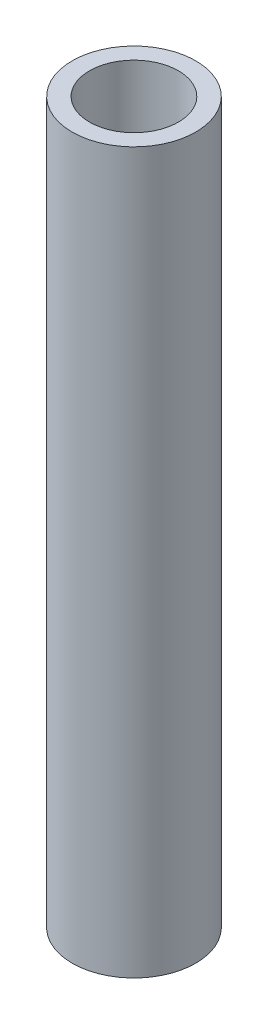
ISO-10303-21;
HEADER;
FILE_DESCRIPTION(('STEP AP214'),'2;1');
FILE_NAME('part.step','',(''),(''),'','','');
FILE_SCHEMA(('AUTOMOTIVE_DESIGN { 1 0 10303 214 1 1 1 1 }'));
ENDSEC;
DATA;
#1=APPLICATION_CONTEXT('core data for automotive mechanical design processes');
#2=APPLICATION_PROTOCOL_DEFINITION('international standard','automotive_design',2000,#1);
#3=PRODUCT_CONTEXT('',#1,'mechanical');
#4=PRODUCT('Part','Part','',(#3));
#5=PRODUCT_RELATED_PRODUCT_CATEGORY('part','',(#4));
#6=PRODUCT_DEFINITION_FORMATION('','',#4);
#7=PRODUCT_DEFINITION_CONTEXT('part definition',#1,'design');
#8=PRODUCT_DEFINITION('design','',#6,#7);
#9=PRODUCT_DEFINITION_SHAPE('','',#8);
#10=(LENGTH_UNIT() NAMED_UNIT(*) SI_UNIT(.MILLI.,.METRE.));
#11=(NAMED_UNIT(*) PLANE_ANGLE_UNIT() SI_UNIT($,.RADIAN.));
#12=(NAMED_UNIT(*) SI_UNIT($,.STERADIAN.) SOLID_ANGLE_UNIT());
#13=UNCERTAINTY_MEASURE_WITH_UNIT(LENGTH_MEASURE(1.E-05),#10,'distance_accuracy_value','');
#14=(GEOMETRIC_REPRESENTATION_CONTEXT(3) GLOBAL_UNCERTAINTY_ASSIGNED_CONTEXT((#13)) GLOBAL_UNIT_ASSIGNED_CONTEXT((#10,
#11,#12)) REPRESENTATION_CONTEXT('',''));
#15=CARTESIAN_POINT('',(0.,0.,0.));
#16=DIRECTION('',(0.,0.,1.));
#17=DIRECTION('',(1.,0.,0.));
#18=AXIS2_PLACEMENT_3D('',#15,#16,#17);
#19=CARTESIAN_POINT('',(0.,37.,0.));
#20=DIRECTION('',(0.,1.,0.));
#21=DIRECTION('',(0.,0.,1.));
#22=AXIS2_PLACEMENT_3D('',#19,#20,#21);
#23=PLANE('',#22);
#24=CARTESIAN_POINT('',(0.,37.,0.));
#25=DIRECTION('',(0.,1.,0.));
#26=DIRECTION('',(0.,0.,1.));
#27=AXIS2_PLACEMENT_3D('',#24,#25,#26);
#28=CIRCLE('',#27,3.175);
#29=CARTESIAN_POINT('',(0.,37.,3.175));
#30=VERTEX_POINT('',#29);
#31=EDGE_CURVE('E10',#30,#30,#28,.T.);
#32=ORIENTED_EDGE('',*,*,#31,.T.);
#33=EDGE_LOOP('',(#32));
#34=FACE_BOUND('',#33,.T.);
#35=CARTESIAN_POINT('',(0.,37.,0.));
#36=DIRECTION('',(0.,1.,0.));
#37=DIRECTION('',(0.,0.,1.));
#38=AXIS2_PLACEMENT_3D('',#35,#36,#37);
#39=CIRCLE('',#38,2.286);
#40=CARTESIAN_POINT('',(0.,37.,2.286));
#41=VERTEX_POINT('',#40);
#42=EDGE_CURVE('E56',#41,#41,#39,.T.);
#43=ORIENTED_EDGE('',*,*,#42,.F.);
#44=EDGE_LOOP('',(#43));
#45=FACE_BOUND('',#44,.T.);
#46=ADVANCED_FACE('F43',(#34,#45),#23,.T.);
#47=CARTESIAN_POINT('',(0.,0.,0.));
#48=DIRECTION('',(0.,1.,0.));
#49=DIRECTION('',(0.,0.,1.));
#50=AXIS2_PLACEMENT_3D('',#47,#48,#49);
#51=PLANE('',#50);
#52=CARTESIAN_POINT('',(0.,0.,0.));
#53=DIRECTION('',(0.,1.,0.));
#54=DIRECTION('',(0.,0.,1.));
#55=AXIS2_PLACEMENT_3D('',#52,#53,#54);
#56=CIRCLE('',#55,3.175);
#57=CARTESIAN_POINT('',(0.,0.,3.175));
#58=VERTEX_POINT('',#57);
#59=EDGE_CURVE('E47',#58,#58,#56,.T.);
#60=ORIENTED_EDGE('',*,*,#59,.F.);
#61=EDGE_LOOP('',(#60));
#62=FACE_BOUND('',#61,.T.);
#63=CARTESIAN_POINT('',(0.,0.,0.));
#64=DIRECTION('',(0.,1.,0.));
#65=DIRECTION('',(0.,0.,1.));
#66=AXIS2_PLACEMENT_3D('',#63,#64,#65);
#67=CIRCLE('',#66,2.286);
#68=CARTESIAN_POINT('',(0.,0.,2.286));
#69=VERTEX_POINT('',#68);
#70=EDGE_CURVE('E58',#69,#69,#67,.T.);
#71=ORIENTED_EDGE('',*,*,#70,.T.);
#72=EDGE_LOOP('',(#71));
#73=FACE_BOUND('',#72,.T.);
#74=ADVANCED_FACE('F70',(#62,#73),#51,.F.);
#75=CARTESIAN_POINT('',(0.,37.,0.));
#76=DIRECTION('',(0.,-1.,0.));
#77=DIRECTION('',(0.,0.,-1.));
#78=AXIS2_PLACEMENT_3D('',#75,#76,#77);
#79=CYLINDRICAL_SURFACE('',#78,3.175);
#80=ORIENTED_EDGE('',*,*,#31,.F.);
#81=EDGE_LOOP('',(#80));
#82=FACE_BOUND('',#81,.T.);
#83=ORIENTED_EDGE('',*,*,#59,.T.);
#84=EDGE_LOOP('',(#83));
#85=FACE_BOUND('',#84,.T.);
#86=ADVANCED_FACE('F45',(#82,#85),#79,.T.);
#87=CARTESIAN_POINT('',(0.,37.,0.));
#88=DIRECTION('',(0.,-1.,0.));
#89=DIRECTION('',(0.,0.,-1.));
#90=AXIS2_PLACEMENT_3D('',#87,#88,#89);
#91=CYLINDRICAL_SURFACE('',#90,2.286);
#92=ORIENTED_EDGE('',*,*,#42,.T.);
#93=EDGE_LOOP('',(#92));
#94=FACE_BOUND('',#93,.T.);
#95=ORIENTED_EDGE('',*,*,#70,.F.);
#96=EDGE_LOOP('',(#95));
#97=FACE_BOUND('',#96,.T.);
#98=ADVANCED_FACE('F66',(#94,#97),#91,.F.);
#99=CLOSED_SHELL('',(#46,#74,#86,#98));
#100=MANIFOLD_SOLID_BREP('B2',#99);
#101=ADVANCED_BREP_SHAPE_REPRESENTATION('',(#18,#100),#14);
#102=SHAPE_DEFINITION_REPRESENTATION(#9,#101);
ENDSEC;
END-ISO-10303-21;
